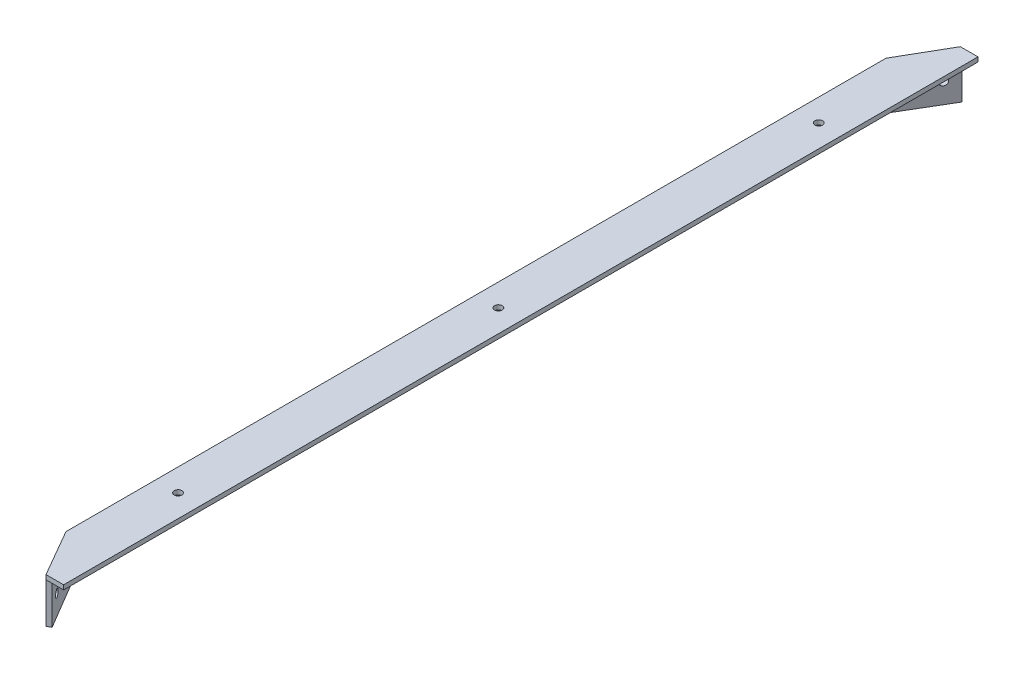
ISO-10303-21;
HEADER;
FILE_DESCRIPTION(('STEP AP214'),'2;1');
FILE_NAME('part.step','',(''),(''),'','','');
FILE_SCHEMA(('AUTOMOTIVE_DESIGN { 1 0 10303 214 1 1 1 1 }'));
ENDSEC;
DATA;
#1=APPLICATION_CONTEXT('core data for automotive mechanical design processes');
#2=APPLICATION_PROTOCOL_DEFINITION('international standard','automotive_design',2000,#1);
#3=PRODUCT_CONTEXT('',#1,'mechanical');
#4=PRODUCT('Part','Part','',(#3));
#5=PRODUCT_RELATED_PRODUCT_CATEGORY('part','',(#4));
#6=PRODUCT_DEFINITION_FORMATION('','',#4);
#7=PRODUCT_DEFINITION_CONTEXT('part definition',#1,'design');
#8=PRODUCT_DEFINITION('design','',#6,#7);
#9=PRODUCT_DEFINITION_SHAPE('','',#8);
#10=(LENGTH_UNIT() NAMED_UNIT(*) SI_UNIT(.MILLI.,.METRE.));
#11=(NAMED_UNIT(*) PLANE_ANGLE_UNIT() SI_UNIT($,.RADIAN.));
#12=(NAMED_UNIT(*) SI_UNIT($,.STERADIAN.) SOLID_ANGLE_UNIT());
#13=UNCERTAINTY_MEASURE_WITH_UNIT(LENGTH_MEASURE(1.E-05),#10,'distance_accuracy_value','');
#14=(GEOMETRIC_REPRESENTATION_CONTEXT(3) GLOBAL_UNCERTAINTY_ASSIGNED_CONTEXT((#13)) GLOBAL_UNIT_ASSIGNED_CONTEXT((#10,
#11,#12)) REPRESENTATION_CONTEXT('',''));
#15=CARTESIAN_POINT('',(0.,0.,0.));
#16=DIRECTION('',(0.,0.,1.));
#17=DIRECTION('',(1.,0.,0.));
#18=AXIS2_PLACEMENT_3D('',#15,#16,#17);
#19=CARTESIAN_POINT('',(7.,0.,640.));
#20=DIRECTION('',(0.,1.,0.));
#21=DIRECTION('',(-1.,0.,0.));
#22=AXIS2_PLACEMENT_3D('',#19,#20,#21);
#23=PLANE('',#22);
#24=DIRECTION('',(0.,0.,-1.));
#25=VECTOR('',#24,1.);
#26=CARTESIAN_POINT('',(0.,0.,640.));
#27=LINE('',#26,#25);
#28=CARTESIAN_POINT('',(0.,0.,640.));
#29=VERTEX_POINT('',#28);
#30=CARTESIAN_POINT('',(0.,0.,-640.));
#31=VERTEX_POINT('',#30);
#32=EDGE_CURVE('E240',#29,#31,#27,.T.);
#33=ORIENTED_EDGE('',*,*,#32,.T.);
#34=DIRECTION('',(0.5,0.,-0.866025403784439));
#35=VECTOR('',#34,1.);
#36=CARTESIAN_POINT('',(0.,0.,-640.));
#37=LINE('',#36,#35);
#38=CARTESIAN_POINT('',(42.5,0.,-713.612159321677));
#39=VERTEX_POINT('',#38);
#40=EDGE_CURVE('E132',#31,#39,#37,.T.);
#41=ORIENTED_EDGE('',*,*,#40,.T.);
#42=DIRECTION('',(0.866025403784443,0.,0.499999999999992));
#43=VECTOR('',#42,1.);
#44=CARTESIAN_POINT('',(42.5,0.,-713.612159321677));
#45=LINE('',#44,#43);
#46=CARTESIAN_POINT('',(48.5621778264911,0.,-710.112159321677));
#47=VERTEX_POINT('',#46);
#48=EDGE_CURVE('E162',#39,#47,#45,.T.);
#49=ORIENTED_EDGE('',*,*,#48,.T.);
#50=DIRECTION('',(-0.509931612811304,0.,0.860214944217817));
#51=VECTOR('',#50,1.);
#52=CARTESIAN_POINT('',(48.5621778264911,0.,-710.112159321677));
#53=LINE('',#52,#51);
#54=CARTESIAN_POINT('',(7.,0.,-640.));
#55=VERTEX_POINT('',#54);
#56=EDGE_CURVE('E156',#47,#55,#53,.T.);
#57=ORIENTED_EDGE('',*,*,#56,.T.);
#58=DIRECTION('',(0.,0.,-1.));
#59=VECTOR('',#58,1.);
#60=CARTESIAN_POINT('',(7.,0.,640.));
#61=LINE('',#60,#59);
#62=CARTESIAN_POINT('',(7.,0.,640.));
#63=VERTEX_POINT('',#62);
#64=EDGE_CURVE('E11',#63,#55,#61,.T.);
#65=ORIENTED_EDGE('',*,*,#64,.F.);
#66=DIRECTION('',(-0.509931612811304,0.,-0.860214944217817));
#67=VECTOR('',#66,1.);
#68=CARTESIAN_POINT('',(48.5621778264911,0.,710.112159321677));
#69=LINE('',#68,#67);
#70=CARTESIAN_POINT('',(48.5621778264911,0.,710.112159321677));
#71=VERTEX_POINT('',#70);
#72=EDGE_CURVE('E210',#71,#63,#69,.T.);
#73=ORIENTED_EDGE('',*,*,#72,.F.);
#74=DIRECTION('',(0.866025403784443,0.,-0.499999999999992));
#75=VECTOR('',#74,1.);
#76=CARTESIAN_POINT('',(42.5,0.,713.612159321677));
#77=LINE('',#76,#75);
#78=CARTESIAN_POINT('',(42.5,0.,713.612159321677));
#79=VERTEX_POINT('',#78);
#80=EDGE_CURVE('E215',#79,#71,#77,.T.);
#81=ORIENTED_EDGE('',*,*,#80,.F.);
#82=DIRECTION('',(0.5,0.,0.866025403784439));
#83=VECTOR('',#82,1.);
#84=CARTESIAN_POINT('',(0.,0.,640.));
#85=LINE('',#84,#83);
#86=EDGE_CURVE('E205',#29,#79,#85,.T.);
#87=ORIENTED_EDGE('',*,*,#86,.F.);
#88=EDGE_LOOP('',(#33,#41,#49,#57,#65,#73,#81,#87));
#89=FACE_BOUND('',#88,.T.);
#90=ADVANCED_FACE('F39',(#89),#23,.F.);
#91=CARTESIAN_POINT('',(6.99999999999999,63.,640.));
#92=DIRECTION('',(-1.,0.,0.));
#93=DIRECTION('',(0.,-1.,0.));
#94=AXIS2_PLACEMENT_3D('',#91,#92,#93);
#95=PLANE('',#94);
#96=ORIENTED_EDGE('',*,*,#64,.T.);
#97=DIRECTION('',(0.,1.,0.));
#98=VECTOR('',#97,1.);
#99=CARTESIAN_POINT('',(6.99999999999999,63.,-640.));
#100=LINE('',#99,#98);
#101=CARTESIAN_POINT('',(6.99999999999999,63.,-640.));
#102=VERTEX_POINT('',#101);
#103=EDGE_CURVE('E176',#55,#102,#100,.T.);
#104=ORIENTED_EDGE('',*,*,#103,.T.);
#105=DIRECTION('',(0.,0.,-1.));
#106=VECTOR('',#105,1.);
#107=CARTESIAN_POINT('',(6.99999999999999,63.,640.));
#108=LINE('',#107,#106);
#109=CARTESIAN_POINT('',(6.99999999999999,63.,640.));
#110=VERTEX_POINT('',#109);
#111=EDGE_CURVE('E46',#110,#102,#108,.T.);
#112=ORIENTED_EDGE('',*,*,#111,.F.);
#113=DIRECTION('',(0.,1.,0.));
#114=VECTOR('',#113,1.);
#115=CARTESIAN_POINT('',(6.99999999999999,63.,640.));
#116=LINE('',#115,#114);
#117=EDGE_CURVE('E236',#63,#110,#116,.T.);
#118=ORIENTED_EDGE('',*,*,#117,.F.);
#119=EDGE_LOOP('',(#96,#104,#112,#118));
#120=FACE_BOUND('',#119,.T.);
#121=ADVANCED_FACE('F255',(#120),#95,.F.);
#122=CARTESIAN_POINT('',(70.,63.,640.));
#123=DIRECTION('',(0.,1.,0.));
#124=DIRECTION('',(-1.,0.,0.));
#125=AXIS2_PLACEMENT_3D('',#122,#123,#124);
#126=PLANE('',#125);
#127=CARTESIAN_POINT('',(35.,63.,0.));
#128=DIRECTION('',(0.,1.,0.));
#129=DIRECTION('',(-1.,0.,0.));
#130=AXIS2_PLACEMENT_3D('',#127,#128,#129);
#131=CIRCLE('',#130,6.);
#132=CARTESIAN_POINT('',(29.,63.,0.));
#133=VERTEX_POINT('',#132);
#134=EDGE_CURVE('E230',#133,#133,#131,.T.);
#135=ORIENTED_EDGE('',*,*,#134,.T.);
#136=EDGE_LOOP('',(#135));
#137=FACE_BOUND('',#136,.T.);
#138=CARTESIAN_POINT('',(35.,63.,500.));
#139=DIRECTION('',(0.,1.,0.));
#140=DIRECTION('',(-1.,0.,0.));
#141=AXIS2_PLACEMENT_3D('',#138,#139,#140);
#142=CIRCLE('',#141,6.);
#143=CARTESIAN_POINT('',(29.,63.,500.));
#144=VERTEX_POINT('',#143);
#145=EDGE_CURVE('E233',#144,#144,#142,.T.);
#146=ORIENTED_EDGE('',*,*,#145,.T.);
#147=EDGE_LOOP('',(#146));
#148=FACE_BOUND('',#147,.T.);
#149=ORIENTED_EDGE('',*,*,#111,.T.);
#150=DIRECTION('',(-0.509931612811304,0.,0.860214944217817));
#151=VECTOR('',#150,1.);
#152=CARTESIAN_POINT('',(48.5621778264911,63.,-710.112159321677));
#153=LINE('',#152,#151);
#154=CARTESIAN_POINT('',(48.5621778264911,63.,-710.112159321677));
#155=VERTEX_POINT('',#154);
#156=EDGE_CURVE('E155',#155,#102,#153,.T.);
#157=ORIENTED_EDGE('',*,*,#156,.F.);
#158=DIRECTION('',(0.866025403784443,0.,0.499999999999992));
#159=VECTOR('',#158,1.);
#160=CARTESIAN_POINT('',(42.5,63.,-713.612159321677));
#161=LINE('',#160,#159);
#162=CARTESIAN_POINT('',(42.5,63.,-713.612159321677));
#163=VERTEX_POINT('',#162);
#164=EDGE_CURVE('E152',#163,#155,#161,.T.);
#165=ORIENTED_EDGE('',*,*,#164,.F.);
#166=DIRECTION('',(1.,0.,0.));
#167=VECTOR('',#166,1.);
#168=CARTESIAN_POINT('',(42.5,63.,-713.612159321677));
#169=LINE('',#168,#167);
#170=CARTESIAN_POINT('',(70.,63.,-713.612159321677));
#171=VERTEX_POINT('',#170);
#172=EDGE_CURVE('E129',#163,#171,#169,.T.);
#173=ORIENTED_EDGE('',*,*,#172,.T.);
#174=DIRECTION('',(0.,0.,-1.));
#175=VECTOR('',#174,1.);
#176=CARTESIAN_POINT('',(70.,63.,640.));
#177=LINE('',#176,#175);
#178=CARTESIAN_POINT('',(70.,63.,713.612159321677));
#179=VERTEX_POINT('',#178);
#180=EDGE_CURVE('E244',#179,#171,#177,.T.);
#181=ORIENTED_EDGE('',*,*,#180,.F.);
#182=DIRECTION('',(1.,0.,0.));
#183=VECTOR('',#182,1.);
#184=CARTESIAN_POINT('',(42.5,63.,713.612159321677));
#185=LINE('',#184,#183);
#186=CARTESIAN_POINT('',(42.5,63.,713.612159321677));
#187=VERTEX_POINT('',#186);
#188=EDGE_CURVE('E192',#187,#179,#185,.T.);
#189=ORIENTED_EDGE('',*,*,#188,.F.);
#190=DIRECTION('',(0.866025403784443,0.,-0.499999999999992));
#191=VECTOR('',#190,1.);
#192=CARTESIAN_POINT('',(42.5,63.,713.612159321677));
#193=LINE('',#192,#191);
#194=CARTESIAN_POINT('',(48.5621778264911,63.,710.112159321677));
#195=VERTEX_POINT('',#194);
#196=EDGE_CURVE('E206',#187,#195,#193,.T.);
#197=ORIENTED_EDGE('',*,*,#196,.T.);
#198=DIRECTION('',(-0.509931612811304,0.,-0.860214944217817));
#199=VECTOR('',#198,1.);
#200=CARTESIAN_POINT('',(48.5621778264911,63.,710.112159321677));
#201=LINE('',#200,#199);
#202=EDGE_CURVE('E209',#195,#110,#201,.T.);
#203=ORIENTED_EDGE('',*,*,#202,.T.);
#204=EDGE_LOOP('',(#149,#157,#165,#173,#181,#189,#197,#203));
#205=FACE_BOUND('',#204,.T.);
#206=CARTESIAN_POINT('',(35.,63.,-500.));
#207=DIRECTION('',(0.,-1.,0.));
#208=DIRECTION('',(-1.,0.,0.));
#209=AXIS2_PLACEMENT_3D('',#206,#207,#208);
#210=CIRCLE('',#209,6.);
#211=CARTESIAN_POINT('',(29.,63.,-500.));
#212=VERTEX_POINT('',#211);
#213=EDGE_CURVE('E173',#212,#212,#210,.T.);
#214=ORIENTED_EDGE('',*,*,#213,.F.);
#215=EDGE_LOOP('',(#214));
#216=FACE_BOUND('',#215,.T.);
#217=ADVANCED_FACE('F247',(#137,#148,#205,#216),#126,.F.);
#218=CARTESIAN_POINT('',(70.,70.,640.));
#219=DIRECTION('',(-1.,0.,0.));
#220=DIRECTION('',(0.,0.,1.));
#221=AXIS2_PLACEMENT_3D('',#218,#219,#220);
#222=PLANE('',#221);
#223=ORIENTED_EDGE('',*,*,#180,.T.);
#224=DIRECTION('',(0.,-1.,0.));
#225=VECTOR('',#224,1.);
#226=CARTESIAN_POINT('',(70.,70.,-713.612159321677));
#227=LINE('',#226,#225);
#228=CARTESIAN_POINT('',(70.,70.,-713.612159321677));
#229=VERTEX_POINT('',#228);
#230=EDGE_CURVE('E133',#229,#171,#227,.T.);
#231=ORIENTED_EDGE('',*,*,#230,.F.);
#232=DIRECTION('',(0.,0.,-1.));
#233=VECTOR('',#232,1.);
#234=CARTESIAN_POINT('',(70.,70.,640.));
#235=LINE('',#234,#233);
#236=CARTESIAN_POINT('',(70.,70.,713.612159321677));
#237=VERTEX_POINT('',#236);
#238=EDGE_CURVE('E145',#237,#229,#235,.T.);
#239=ORIENTED_EDGE('',*,*,#238,.F.);
#240=DIRECTION('',(0.,-1.,0.));
#241=VECTOR('',#240,1.);
#242=CARTESIAN_POINT('',(70.,70.,713.612159321677));
#243=LINE('',#242,#241);
#244=EDGE_CURVE('E197',#237,#179,#243,.T.);
#245=ORIENTED_EDGE('',*,*,#244,.T.);
#246=EDGE_LOOP('',(#223,#231,#239,#245));
#247=FACE_BOUND('',#246,.T.);
#248=ADVANCED_FACE('F274',(#247),#222,.F.);
#249=CARTESIAN_POINT('',(0.,70.,640.));
#250=DIRECTION('',(0.,-1.,0.));
#251=DIRECTION('',(0.,0.,-1.));
#252=AXIS2_PLACEMENT_3D('',#249,#250,#251);
#253=PLANE('',#252);
#254=DIRECTION('',(0.5,0.,-0.866025403784439));
#255=VECTOR('',#254,1.);
#256=CARTESIAN_POINT('',(0.,70.,-640.));
#257=LINE('',#256,#255);
#258=CARTESIAN_POINT('',(0.,70.,-640.));
#259=VERTEX_POINT('',#258);
#260=CARTESIAN_POINT('',(42.5,70.,-713.612159321677));
#261=VERTEX_POINT('',#260);
#262=EDGE_CURVE('E136',#259,#261,#257,.T.);
#263=ORIENTED_EDGE('',*,*,#262,.F.);
#264=DIRECTION('',(0.,0.,-1.));
#265=VECTOR('',#264,1.);
#266=CARTESIAN_POINT('',(0.,70.,640.));
#267=LINE('',#266,#265);
#268=CARTESIAN_POINT('',(0.,70.,640.));
#269=VERTEX_POINT('',#268);
#270=EDGE_CURVE('E61',#269,#259,#267,.T.);
#271=ORIENTED_EDGE('',*,*,#270,.F.);
#272=DIRECTION('',(0.5,0.,0.866025403784439));
#273=VECTOR('',#272,1.);
#274=CARTESIAN_POINT('',(0.,70.,640.));
#275=LINE('',#274,#273);
#276=CARTESIAN_POINT('',(42.5,70.,713.612159321677));
#277=VERTEX_POINT('',#276);
#278=EDGE_CURVE('E193',#269,#277,#275,.T.);
#279=ORIENTED_EDGE('',*,*,#278,.T.);
#280=DIRECTION('',(1.,0.,0.));
#281=VECTOR('',#280,1.);
#282=CARTESIAN_POINT('',(42.5,70.,713.612159321677));
#283=LINE('',#282,#281);
#284=EDGE_CURVE('E195',#277,#237,#283,.T.);
#285=ORIENTED_EDGE('',*,*,#284,.T.);
#286=ORIENTED_EDGE('',*,*,#238,.T.);
#287=DIRECTION('',(1.,0.,0.));
#288=VECTOR('',#287,1.);
#289=CARTESIAN_POINT('',(42.5,70.,-713.612159321677));
#290=LINE('',#289,#288);
#291=EDGE_CURVE('E126',#261,#229,#290,.T.);
#292=ORIENTED_EDGE('',*,*,#291,.F.);
#293=EDGE_LOOP('',(#263,#271,#279,#285,#286,#292));
#294=FACE_BOUND('',#293,.T.);
#295=CARTESIAN_POINT('',(35.,70.,500.));
#296=DIRECTION('',(0.,1.,0.));
#297=DIRECTION('',(0.,0.,1.));
#298=AXIS2_PLACEMENT_3D('',#295,#296,#297);
#299=CIRCLE('',#298,6.);
#300=CARTESIAN_POINT('',(35.,70.,506.));
#301=VERTEX_POINT('',#300);
#302=EDGE_CURVE('E224',#301,#301,#299,.T.);
#303=ORIENTED_EDGE('',*,*,#302,.F.);
#304=EDGE_LOOP('',(#303));
#305=FACE_BOUND('',#304,.T.);
#306=CARTESIAN_POINT('',(35.,70.,0.));
#307=DIRECTION('',(0.,1.,0.));
#308=DIRECTION('',(0.,0.,1.));
#309=AXIS2_PLACEMENT_3D('',#306,#307,#308);
#310=CIRCLE('',#309,6.);
#311=CARTESIAN_POINT('',(35.,70.,6.));
#312=VERTEX_POINT('',#311);
#313=EDGE_CURVE('E227',#312,#312,#310,.T.);
#314=ORIENTED_EDGE('',*,*,#313,.F.);
#315=EDGE_LOOP('',(#314));
#316=FACE_BOUND('',#315,.T.);
#317=CARTESIAN_POINT('',(35.,70.,-500.));
#318=DIRECTION('',(0.,-1.,0.));
#319=DIRECTION('',(0.,0.,-1.));
#320=AXIS2_PLACEMENT_3D('',#317,#318,#319);
#321=CIRCLE('',#320,6.);
#322=CARTESIAN_POINT('',(35.,70.,-506.));
#323=VERTEX_POINT('',#322);
#324=EDGE_CURVE('E170',#323,#323,#321,.T.);
#325=ORIENTED_EDGE('',*,*,#324,.T.);
#326=EDGE_LOOP('',(#325));
#327=FACE_BOUND('',#326,.T.);
#328=ADVANCED_FACE('F142',(#294,#305,#316,#327),#253,.F.);
#329=CARTESIAN_POINT('',(0.,0.,640.));
#330=DIRECTION('',(1.,0.,0.));
#331=DIRECTION('',(0.,0.,-1.));
#332=AXIS2_PLACEMENT_3D('',#329,#330,#331);
#333=PLANE('',#332);
#334=ORIENTED_EDGE('',*,*,#270,.T.);
#335=DIRECTION('',(0.,-1.,0.));
#336=VECTOR('',#335,1.);
#337=CARTESIAN_POINT('',(0.,0.,-640.));
#338=LINE('',#337,#336);
#339=EDGE_CURVE('E140',#259,#31,#338,.T.);
#340=ORIENTED_EDGE('',*,*,#339,.T.);
#341=ORIENTED_EDGE('',*,*,#32,.F.);
#342=DIRECTION('',(0.,-1.,0.));
#343=VECTOR('',#342,1.);
#344=CARTESIAN_POINT('',(0.,0.,640.));
#345=LINE('',#344,#343);
#346=EDGE_CURVE('E53',#269,#29,#345,.T.);
#347=ORIENTED_EDGE('',*,*,#346,.F.);
#348=EDGE_LOOP('',(#334,#340,#341,#347));
#349=FACE_BOUND('',#348,.T.);
#350=ADVANCED_FACE('F281',(#349),#333,.F.);
#351=CARTESIAN_POINT('',(35.,60.,0.));
#352=DIRECTION('',(0.,1.,0.));
#353=DIRECTION('',(0.,0.,1.));
#354=AXIS2_PLACEMENT_3D('',#351,#352,#353);
#355=CYLINDRICAL_SURFACE('',#354,6.);
#356=ORIENTED_EDGE('',*,*,#313,.T.);
#357=EDGE_LOOP('',(#356));
#358=FACE_BOUND('',#357,.T.);
#359=ORIENTED_EDGE('',*,*,#134,.F.);
#360=EDGE_LOOP('',(#359));
#361=FACE_BOUND('',#360,.T.);
#362=ADVANCED_FACE('F329',(#358,#361),#355,.F.);
#363=CARTESIAN_POINT('',(35.,60.,500.));
#364=DIRECTION('',(0.,1.,0.));
#365=DIRECTION('',(0.,0.,1.));
#366=AXIS2_PLACEMENT_3D('',#363,#364,#365);
#367=CYLINDRICAL_SURFACE('',#366,6.);
#368=ORIENTED_EDGE('',*,*,#302,.T.);
#369=EDGE_LOOP('',(#368));
#370=FACE_BOUND('',#369,.T.);
#371=ORIENTED_EDGE('',*,*,#145,.F.);
#372=EDGE_LOOP('',(#371));
#373=FACE_BOUND('',#372,.T.);
#374=ADVANCED_FACE('F340',(#370,#373),#367,.F.);
#375=CARTESIAN_POINT('',(0.,63.,640.));
#376=DIRECTION('',(0.866025403784439,0.,-0.5));
#377=DIRECTION('',(-0.5,0.,-0.866025403784439));
#378=AXIS2_PLACEMENT_3D('',#375,#376,#377);
#379=PLANE('',#378);
#380=CARTESIAN_POINT('',(31.9145711589444,31.5,695.277658749064));
#381=DIRECTION('',(0.866025403784439,0.,-0.5));
#382=DIRECTION('',(-0.5,0.,-0.866025403784439));
#383=AXIS2_PLACEMENT_3D('',#380,#381,#382);
#384=ELLIPSE('',#383,6.00039722141594,5.99999999999998);
#385=CARTESIAN_POINT('',(28.9143725482365,31.5,690.08116232252));
#386=VERTEX_POINT('',#385);
#387=EDGE_CURVE('E189',#386,#386,#384,.T.);
#388=ORIENTED_EDGE('',*,*,#387,.T.);
#389=EDGE_LOOP('',(#388));
#390=FACE_BOUND('',#389,.T.);
#391=CARTESIAN_POINT('',(12.4105822152888,31.5,661.495758948391));
#392=DIRECTION('',(0.866025403784439,0.,-0.5));
#393=DIRECTION('',(-0.5,0.,-0.866025403784439));
#394=AXIS2_PLACEMENT_3D('',#391,#392,#393);
#395=ELLIPSE('',#394,6.00039722141603,6.00000000000007);
#396=CARTESIAN_POINT('',(9.4103836045808,31.5,656.299262521847));
#397=VERTEX_POINT('',#396);
#398=EDGE_CURVE('E184',#397,#397,#395,.T.);
#399=ORIENTED_EDGE('',*,*,#398,.T.);
#400=EDGE_LOOP('',(#399));
#401=FACE_BOUND('',#400,.T.);
#402=ORIENTED_EDGE('',*,*,#86,.T.);
#403=DIRECTION('',(0.,-1.,0.));
#404=VECTOR('',#403,1.);
#405=CARTESIAN_POINT('',(42.5,63.,713.612159321677));
#406=LINE('',#405,#404);
#407=EDGE_CURVE('E221',#187,#79,#406,.T.);
#408=ORIENTED_EDGE('',*,*,#407,.F.);
#409=DIRECTION('',(0.,-1.,0.));
#410=VECTOR('',#409,1.);
#411=CARTESIAN_POINT('',(42.5,70.,713.612159321677));
#412=LINE('',#411,#410);
#413=EDGE_CURVE('E202',#277,#187,#412,.T.);
#414=ORIENTED_EDGE('',*,*,#413,.F.);
#415=ORIENTED_EDGE('',*,*,#278,.F.);
#416=ORIENTED_EDGE('',*,*,#346,.T.);
#417=EDGE_LOOP('',(#402,#408,#414,#415,#416));
#418=FACE_BOUND('',#417,.T.);
#419=ADVANCED_FACE('F266',(#390,#401,#418),#379,.F.);
#420=CARTESIAN_POINT('',(42.5,63.,713.612159321677));
#421=DIRECTION('',(-0.499999999999992,0.,-0.866025403784443));
#422=DIRECTION('',(-0.866025403784443,0.,0.499999999999992));
#423=AXIS2_PLACEMENT_3D('',#420,#421,#422);
#424=PLANE('',#423);
#425=ORIENTED_EDGE('',*,*,#80,.T.);
#426=DIRECTION('',(0.,-1.,0.));
#427=VECTOR('',#426,1.);
#428=CARTESIAN_POINT('',(48.5621778264911,63.,710.112159321677));
#429=LINE('',#428,#427);
#430=EDGE_CURVE('E213',#195,#71,#429,.T.);
#431=ORIENTED_EDGE('',*,*,#430,.F.);
#432=ORIENTED_EDGE('',*,*,#196,.F.);
#433=ORIENTED_EDGE('',*,*,#407,.T.);
#434=EDGE_LOOP('',(#425,#431,#432,#433));
#435=FACE_BOUND('',#434,.T.);
#436=ADVANCED_FACE('F263',(#435),#424,.F.);
#437=CARTESIAN_POINT('',(48.5621778264911,63.,710.112159321677));
#438=DIRECTION('',(-0.860214944217817,0.,0.509931612811304));
#439=DIRECTION('',(0.509931612811304,0.,0.860214944217817));
#440=AXIS2_PLACEMENT_3D('',#437,#438,#439);
#441=PLANE('',#440);
#442=CARTESIAN_POINT('',(37.7261310542509,31.5,691.832591757049));
#443=DIRECTION('',(0.860214944217817,0.,-0.509931612811304));
#444=DIRECTION('',(-0.509931612811304,0.,-0.860214944217817));
#445=AXIS2_PLACEMENT_3D('',#442,#443,#444);
#446=CIRCLE('',#445,5.99999999999998);
#447=CARTESIAN_POINT('',(34.6665413773831,31.5,686.671302091742));
#448=VERTEX_POINT('',#447);
#449=EDGE_CURVE('E181',#448,#448,#446,.T.);
#450=ORIENTED_EDGE('',*,*,#449,.F.);
#451=EDGE_LOOP('',(#450));
#452=FACE_BOUND('',#451,.T.);
#453=CARTESIAN_POINT('',(17.8360467722402,31.5,658.279567564629));
#454=DIRECTION('',(0.860214944217817,0.,-0.509931612811304));
#455=DIRECTION('',(-0.509931612811304,0.,-0.860214944217817));
#456=AXIS2_PLACEMENT_3D('',#453,#454,#455);
#457=CIRCLE('',#456,6.00000000000007);
#458=CARTESIAN_POINT('',(14.7764570953724,31.5,653.118277899322));
#459=VERTEX_POINT('',#458);
#460=EDGE_CURVE('E180',#459,#459,#457,.T.);
#461=ORIENTED_EDGE('',*,*,#460,.F.);
#462=EDGE_LOOP('',(#461));
#463=FACE_BOUND('',#462,.T.);
#464=ORIENTED_EDGE('',*,*,#72,.T.);
#465=ORIENTED_EDGE('',*,*,#117,.T.);
#466=ORIENTED_EDGE('',*,*,#202,.F.);
#467=ORIENTED_EDGE('',*,*,#430,.T.);
#468=EDGE_LOOP('',(#464,#465,#466,#467));
#469=FACE_BOUND('',#468,.T.);
#470=ADVANCED_FACE('F261',(#452,#463,#469),#441,.F.);
#471=CARTESIAN_POINT('',(42.5,70.,713.612159321677));
#472=DIRECTION('',(0.,0.,-1.));
#473=DIRECTION('',(-1.,0.,0.));
#474=AXIS2_PLACEMENT_3D('',#471,#472,#473);
#475=PLANE('',#474);
#476=ORIENTED_EDGE('',*,*,#188,.T.);
#477=ORIENTED_EDGE('',*,*,#244,.F.);
#478=ORIENTED_EDGE('',*,*,#284,.F.);
#479=ORIENTED_EDGE('',*,*,#413,.T.);
#480=EDGE_LOOP('',(#476,#477,#478,#479));
#481=FACE_BOUND('',#480,.T.);
#482=ADVANCED_FACE('F271',(#481),#475,.F.);
#483=CARTESIAN_POINT('',(11.8145421627155,31.5,661.849088854308));
#484=DIRECTION('',(0.860214944217817,0.,-0.509931612811304));
#485=DIRECTION('',(-0.509931612811304,0.,-0.860214944217817));
#486=AXIS2_PLACEMENT_3D('',#483,#484,#485);
#487=CYLINDRICAL_SURFACE('',#486,6.00000000000007);
#488=ORIENTED_EDGE('',*,*,#460,.T.);
#489=EDGE_LOOP('',(#488));
#490=FACE_BOUND('',#489,.T.);
#491=ORIENTED_EDGE('',*,*,#398,.F.);
#492=EDGE_LOOP('',(#491));
#493=FACE_BOUND('',#492,.T.);
#494=ADVANCED_FACE('F420',(#490,#493),#487,.F.);
#495=CARTESIAN_POINT('',(31.7046264447262,31.5,695.402113046728));
#496=DIRECTION('',(0.860214944217817,0.,-0.509931612811304));
#497=DIRECTION('',(-0.509931612811304,0.,-0.860214944217817));
#498=AXIS2_PLACEMENT_3D('',#495,#496,#497);
#499=CYLINDRICAL_SURFACE('',#498,5.99999999999998);
#500=ORIENTED_EDGE('',*,*,#449,.T.);
#501=EDGE_LOOP('',(#500));
#502=FACE_BOUND('',#501,.T.);
#503=ORIENTED_EDGE('',*,*,#387,.F.);
#504=EDGE_LOOP('',(#503));
#505=FACE_BOUND('',#504,.T.);
#506=ADVANCED_FACE('F352',(#502,#505),#499,.F.);
#507=CARTESIAN_POINT('',(35.,60.,-500.));
#508=DIRECTION('',(0.,1.,0.));
#509=DIRECTION('',(0.,0.,-1.));
#510=AXIS2_PLACEMENT_3D('',#507,#508,#509);
#511=CYLINDRICAL_SURFACE('',#510,6.);
#512=ORIENTED_EDGE('',*,*,#324,.F.);
#513=EDGE_LOOP('',(#512));
#514=FACE_BOUND('',#513,.T.);
#515=ORIENTED_EDGE('',*,*,#213,.T.);
#516=EDGE_LOOP('',(#515));
#517=FACE_BOUND('',#516,.T.);
#518=ADVANCED_FACE('F348',(#514,#517),#511,.F.);
#519=CARTESIAN_POINT('',(0.,63.,-640.));
#520=DIRECTION('',(0.866025403784439,0.,0.5));
#521=DIRECTION('',(-0.5,0.,0.866025403784439));
#522=AXIS2_PLACEMENT_3D('',#519,#520,#521);
#523=PLANE('',#522);
#524=CARTESIAN_POINT('',(31.9145711589444,31.5,-695.277658749064));
#525=DIRECTION('',(-0.866025403784439,0.,-0.5));
#526=DIRECTION('',(-0.5,0.,0.866025403784439));
#527=AXIS2_PLACEMENT_3D('',#524,#525,#526);
#528=ELLIPSE('',#527,6.00039722141594,5.99999999999998);
#529=CARTESIAN_POINT('',(28.9143725482365,31.5,-690.08116232252));
#530=VERTEX_POINT('',#529);
#531=EDGE_CURVE('E150',#530,#530,#528,.T.);
#532=ORIENTED_EDGE('',*,*,#531,.F.);
#533=EDGE_LOOP('',(#532));
#534=FACE_BOUND('',#533,.T.);
#535=CARTESIAN_POINT('',(12.4105822152888,31.5,-661.495758948391));
#536=DIRECTION('',(-0.866025403784439,0.,-0.5));
#537=DIRECTION('',(-0.5,0.,0.866025403784439));
#538=AXIS2_PLACEMENT_3D('',#535,#536,#537);
#539=ELLIPSE('',#538,6.00039722141603,6.00000000000007);
#540=CARTESIAN_POINT('',(9.4103836045808,31.5,-656.299262521847));
#541=VERTEX_POINT('',#540);
#542=EDGE_CURVE('E541',#541,#541,#539,.T.);
#543=ORIENTED_EDGE('',*,*,#542,.F.);
#544=EDGE_LOOP('',(#543));
#545=FACE_BOUND('',#544,.T.);
#546=ORIENTED_EDGE('',*,*,#40,.F.);
#547=ORIENTED_EDGE('',*,*,#339,.F.);
#548=ORIENTED_EDGE('',*,*,#262,.T.);
#549=DIRECTION('',(0.,-1.,0.));
#550=VECTOR('',#549,1.);
#551=CARTESIAN_POINT('',(42.5,70.,-713.612159321677));
#552=LINE('',#551,#550);
#553=EDGE_CURVE('E121',#261,#163,#552,.T.);
#554=ORIENTED_EDGE('',*,*,#553,.T.);
#555=DIRECTION('',(0.,-1.,0.));
#556=VECTOR('',#555,1.);
#557=CARTESIAN_POINT('',(42.5,63.,-713.612159321677));
#558=LINE('',#557,#556);
#559=EDGE_CURVE('E168',#163,#39,#558,.T.);
#560=ORIENTED_EDGE('',*,*,#559,.T.);
#561=EDGE_LOOP('',(#546,#547,#548,#554,#560));
#562=FACE_BOUND('',#561,.T.);
#563=ADVANCED_FACE('F138',(#534,#545,#562),#523,.F.);
#564=CARTESIAN_POINT('',(42.5,63.,-713.612159321677));
#565=DIRECTION('',(-0.499999999999992,0.,0.866025403784443));
#566=DIRECTION('',(-0.866025403784443,0.,-0.499999999999992));
#567=AXIS2_PLACEMENT_3D('',#564,#565,#566);
#568=PLANE('',#567);
#569=ORIENTED_EDGE('',*,*,#48,.F.);
#570=ORIENTED_EDGE('',*,*,#559,.F.);
#571=ORIENTED_EDGE('',*,*,#164,.T.);
#572=DIRECTION('',(0.,-1.,0.));
#573=VECTOR('',#572,1.);
#574=CARTESIAN_POINT('',(48.5621778264911,63.,-710.112159321677));
#575=LINE('',#574,#573);
#576=EDGE_CURVE('E159',#155,#47,#575,.T.);
#577=ORIENTED_EDGE('',*,*,#576,.T.);
#578=EDGE_LOOP('',(#569,#570,#571,#577));
#579=FACE_BOUND('',#578,.T.);
#580=ADVANCED_FACE('F362',(#579),#568,.F.);
#581=CARTESIAN_POINT('',(48.5621778264911,63.,-710.112159321677));
#582=DIRECTION('',(-0.860214944217817,0.,-0.509931612811304));
#583=DIRECTION('',(0.509931612811304,0.,-0.860214944217817));
#584=AXIS2_PLACEMENT_3D('',#581,#582,#583);
#585=PLANE('',#584);
#586=CARTESIAN_POINT('',(37.7261310542509,31.5,-691.832591757049));
#587=DIRECTION('',(-0.860214944217817,0.,-0.509931612811304));
#588=DIRECTION('',(-0.509931612811304,0.,0.860214944217817));
#589=AXIS2_PLACEMENT_3D('',#586,#587,#588);
#590=CIRCLE('',#589,5.99999999999998);
#591=CARTESIAN_POINT('',(34.6665413773831,31.5,-686.671302091742));
#592=VERTEX_POINT('',#591);
#593=EDGE_CURVE('E538',#592,#592,#590,.T.);
#594=ORIENTED_EDGE('',*,*,#593,.T.);
#595=EDGE_LOOP('',(#594));
#596=FACE_BOUND('',#595,.T.);
#597=CARTESIAN_POINT('',(17.8360467722402,31.5,-658.279567564629));
#598=DIRECTION('',(-0.860214944217817,0.,-0.509931612811304));
#599=DIRECTION('',(-0.509931612811304,0.,0.860214944217817));
#600=AXIS2_PLACEMENT_3D('',#597,#598,#599);
#601=CIRCLE('',#600,6.00000000000007);
#602=CARTESIAN_POINT('',(14.7764570953724,31.5,-653.118277899322));
#603=VERTEX_POINT('',#602);
#604=EDGE_CURVE('E545',#603,#603,#601,.T.);
#605=ORIENTED_EDGE('',*,*,#604,.T.);
#606=EDGE_LOOP('',(#605));
#607=FACE_BOUND('',#606,.T.);
#608=ORIENTED_EDGE('',*,*,#56,.F.);
#609=ORIENTED_EDGE('',*,*,#576,.F.);
#610=ORIENTED_EDGE('',*,*,#156,.T.);
#611=ORIENTED_EDGE('',*,*,#103,.F.);
#612=EDGE_LOOP('',(#608,#609,#610,#611));
#613=FACE_BOUND('',#612,.T.);
#614=ADVANCED_FACE('F254',(#596,#607,#613),#585,.F.);
#615=CARTESIAN_POINT('',(42.5,70.,-713.612159321677));
#616=DIRECTION('',(0.,0.,1.));
#617=DIRECTION('',(-1.,0.,0.));
#618=AXIS2_PLACEMENT_3D('',#615,#616,#617);
#619=PLANE('',#618);
#620=ORIENTED_EDGE('',*,*,#172,.F.);
#621=ORIENTED_EDGE('',*,*,#553,.F.);
#622=ORIENTED_EDGE('',*,*,#291,.T.);
#623=ORIENTED_EDGE('',*,*,#230,.T.);
#624=EDGE_LOOP('',(#620,#621,#622,#623));
#625=FACE_BOUND('',#624,.T.);
#626=ADVANCED_FACE('F123',(#625),#619,.F.);
#627=CARTESIAN_POINT('',(11.8145421627155,31.5,-661.849088854308));
#628=DIRECTION('',(0.860214944217817,0.,0.509931612811304));
#629=DIRECTION('',(-0.509931612811304,0.,0.860214944217817));
#630=AXIS2_PLACEMENT_3D('',#627,#628,#629);
#631=CYLINDRICAL_SURFACE('',#630,6.00000000000007);
#632=ORIENTED_EDGE('',*,*,#604,.F.);
#633=EDGE_LOOP('',(#632));
#634=FACE_BOUND('',#633,.T.);
#635=ORIENTED_EDGE('',*,*,#542,.T.);
#636=EDGE_LOOP('',(#635));
#637=FACE_BOUND('',#636,.T.);
#638=ADVANCED_FACE('F393',(#634,#637),#631,.F.);
#639=CARTESIAN_POINT('',(31.7046264447262,31.5,-695.402113046728));
#640=DIRECTION('',(0.860214944217817,0.,0.509931612811304));
#641=DIRECTION('',(-0.509931612811304,0.,0.860214944217817));
#642=AXIS2_PLACEMENT_3D('',#639,#640,#641);
#643=CYLINDRICAL_SURFACE('',#642,5.99999999999998);
#644=ORIENTED_EDGE('',*,*,#593,.F.);
#645=EDGE_LOOP('',(#644));
#646=FACE_BOUND('',#645,.T.);
#647=ORIENTED_EDGE('',*,*,#531,.T.);
#648=EDGE_LOOP('',(#647));
#649=FACE_BOUND('',#648,.T.);
#650=ADVANCED_FACE('F402',(#646,#649),#643,.F.);
#651=CLOSED_SHELL('',(#90,#121,#217,#248,#328,#350,#362,#374,#419,#436,#470,#482,#494,#506,#518,
#563,#580,#614,#626,#638,#650));
#652=MANIFOLD_SOLID_BREP('B2',#651);
#653=ADVANCED_BREP_SHAPE_REPRESENTATION('',(#18,#652),#14);
#654=SHAPE_DEFINITION_REPRESENTATION(#9,#653);
ENDSEC;
END-ISO-10303-21;
